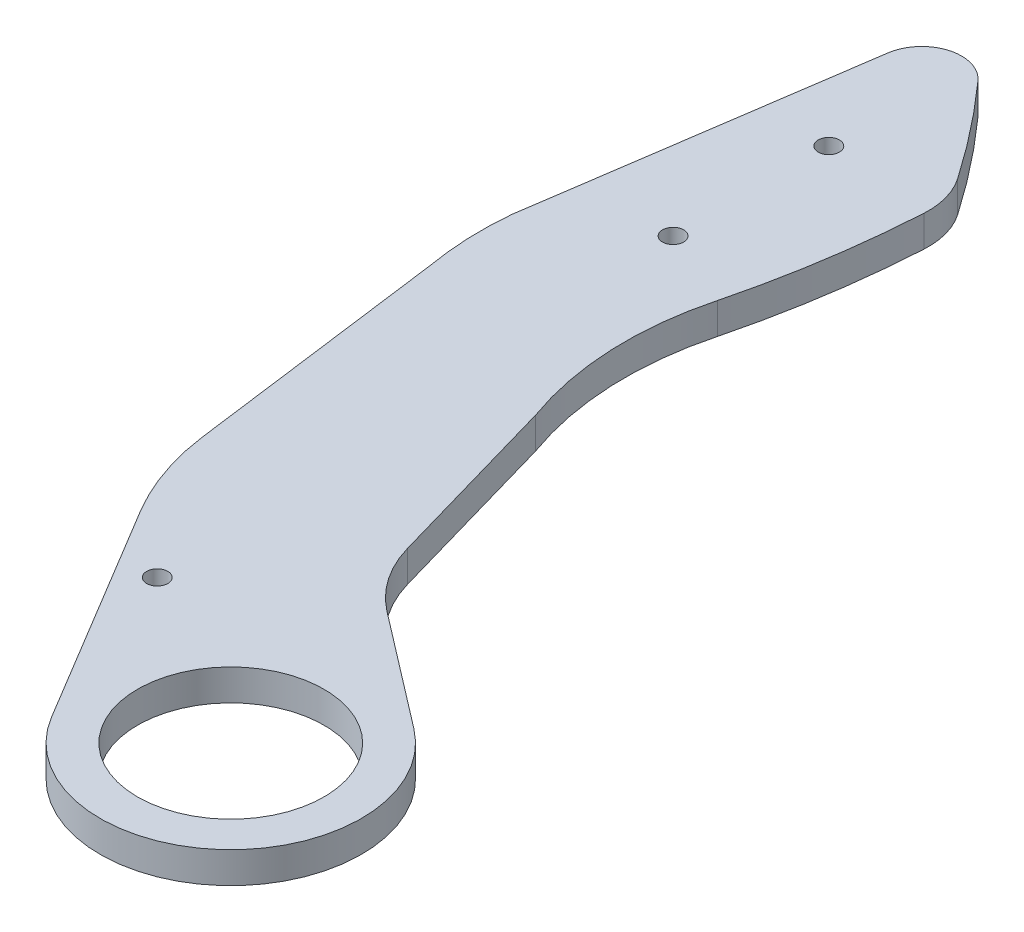
ISO-10303-21;
HEADER;
FILE_DESCRIPTION(('STEP AP214'),'2;1');
FILE_NAME('part.step','',(''),(''),'','','');
FILE_SCHEMA(('AUTOMOTIVE_DESIGN { 1 0 10303 214 1 1 1 1 }'));
ENDSEC;
DATA;
#1=APPLICATION_CONTEXT('core data for automotive mechanical design processes');
#2=APPLICATION_PROTOCOL_DEFINITION('international standard','automotive_design',2000,#1);
#3=PRODUCT_CONTEXT('',#1,'mechanical');
#4=PRODUCT('Part','Part','',(#3));
#5=PRODUCT_RELATED_PRODUCT_CATEGORY('part','',(#4));
#6=PRODUCT_DEFINITION_FORMATION('','',#4);
#7=PRODUCT_DEFINITION_CONTEXT('part definition',#1,'design');
#8=PRODUCT_DEFINITION('design','',#6,#7);
#9=PRODUCT_DEFINITION_SHAPE('','',#8);
#10=(LENGTH_UNIT() NAMED_UNIT(*) SI_UNIT(.MILLI.,.METRE.));
#11=(NAMED_UNIT(*) PLANE_ANGLE_UNIT() SI_UNIT($,.RADIAN.));
#12=(NAMED_UNIT(*) SI_UNIT($,.STERADIAN.) SOLID_ANGLE_UNIT());
#13=UNCERTAINTY_MEASURE_WITH_UNIT(LENGTH_MEASURE(1.E-05),#10,'distance_accuracy_value','');
#14=(GEOMETRIC_REPRESENTATION_CONTEXT(3) GLOBAL_UNCERTAINTY_ASSIGNED_CONTEXT((#13)) GLOBAL_UNIT_ASSIGNED_CONTEXT((#10,
#11,#12)) REPRESENTATION_CONTEXT('',''));
#15=CARTESIAN_POINT('',(0.,0.,0.));
#16=DIRECTION('',(0.,0.,1.));
#17=DIRECTION('',(1.,0.,0.));
#18=AXIS2_PLACEMENT_3D('',#15,#16,#17);
#19=CARTESIAN_POINT('',(0.,5.,0.));
#20=DIRECTION('',(0.,-1.,0.));
#21=DIRECTION('',(0.,0.,-1.));
#22=AXIS2_PLACEMENT_3D('',#19,#20,#21);
#23=PLANE('',#22);
#24=CARTESIAN_POINT('',(-35.,5.,-131.));
#25=DIRECTION('',(0.,1.,0.));
#26=DIRECTION('',(0.,0.,1.));
#27=AXIS2_PLACEMENT_3D('',#24,#25,#26);
#28=CIRCLE('',#27,1.7);
#29=CARTESIAN_POINT('',(-35.,5.,-129.3));
#30=VERTEX_POINT('',#29);
#31=EDGE_CURVE('E357',#30,#30,#28,.T.);
#32=ORIENTED_EDGE('',*,*,#31,.F.);
#33=EDGE_LOOP('',(#32));
#34=FACE_BOUND('',#33,.T.);
#35=CARTESIAN_POINT('',(-35.,5.,-106.));
#36=DIRECTION('',(0.,1.,0.));
#37=DIRECTION('',(0.,0.,1.));
#38=AXIS2_PLACEMENT_3D('',#35,#36,#37);
#39=CIRCLE('',#38,1.7);
#40=CARTESIAN_POINT('',(-35.,5.,-104.3));
#41=VERTEX_POINT('',#40);
#42=EDGE_CURVE('E366',#41,#41,#39,.T.);
#43=ORIENTED_EDGE('',*,*,#42,.F.);
#44=EDGE_LOOP('',(#43));
#45=FACE_BOUND('',#44,.T.);
#46=CARTESIAN_POINT('',(0.,5.,0.));
#47=DIRECTION('',(0.,1.,0.));
#48=DIRECTION('',(0.,0.,-1.));
#49=AXIS2_PLACEMENT_3D('',#46,#47,#48);
#50=CIRCLE('',#49,20.975);
#51=CARTESIAN_POINT('',(-17.9774630782299,5.,10.8056210497537));
#52=VERTEX_POINT('',#51);
#53=CARTESIAN_POINT('',(12.7564859565184,5.,-16.6500057369705));
#54=VERTEX_POINT('',#53);
#55=EDGE_CURVE('E219',#52,#54,#50,.T.);
#56=ORIENTED_EDGE('',*,*,#55,.T.);
#57=DIRECTION('',(-0.793802418925886,0.,-0.608175730942474));
#58=VECTOR('',#57,1.);
#59=CARTESIAN_POINT('',(12.7564859565184,5.,-16.6500057369705));
#60=LINE('',#59,#58);
#61=CARTESIAN_POINT('',(-5.81260332637787,5.,-30.8768072411063));
#62=VERTEX_POINT('',#61);
#63=EDGE_CURVE('E119',#54,#62,#60,.T.);
#64=ORIENTED_EDGE('',*,*,#63,.T.);
#65=CARTESIAN_POINT('',(6.35091129247161,5.,-46.7528556196241));
#66=DIRECTION('',(0.,-1.,0.));
#67=DIRECTION('',(0.,0.,-1.));
#68=AXIS2_PLACEMENT_3D('',#65,#66,#67);
#69=CIRCLE('',#68,20.);
#70=CARTESIAN_POINT('',(-12.8764196508518,5.,-41.2474269536691));
#71=VERTEX_POINT('',#70);
#72=EDGE_CURVE('E264',#62,#71,#69,.T.);
#73=ORIENTED_EDGE('',*,*,#72,.T.);
#74=DIRECTION('',(-0.275271433297746,0.,-0.96136654716617));
#75=VECTOR('',#74,1.);
#76=CARTESIAN_POINT('',(-12.8764196508518,5.,-41.2474269536691));
#77=LINE('',#76,#75);
#78=CARTESIAN_POINT('',(-21.1345626497842,5.,-70.0884233686542));
#79=VERTEX_POINT('',#78);
#80=EDGE_CURVE('E284',#71,#79,#77,.T.);
#81=ORIENTED_EDGE('',*,*,#80,.T.);
#82=CARTESIAN_POINT('',(26.9937980567859,5.,-87.4580042567529));
#83=DIRECTION('',(0.,-1.,0.));
#84=DIRECTION('',(0.,0.,1.));
#85=AXIS2_PLACEMENT_3D('',#82,#83,#84);
#86=CIRCLE('',#85,51.1668002178163);
#87=CARTESIAN_POINT('',(-22.4565511628832,5.,-100.599709115054));
#88=VERTEX_POINT('',#87);
#89=EDGE_CURVE('E280',#79,#88,#86,.T.);
#90=ORIENTED_EDGE('',*,*,#89,.T.);
#91=CARTESIAN_POINT('',(-171.2572125516,5.,-138.292363187831));
#92=DIRECTION('',(0.,1.,0.));
#93=DIRECTION('',(0.,0.,1.));
#94=AXIS2_PLACEMENT_3D('',#91,#92,#93);
#95=CIRCLE('',#94,153.500400653449);
#96=CARTESIAN_POINT('',(-18.0206236675566,5.,-129.296762710251));
#97=VERTEX_POINT('',#96);
#98=EDGE_CURVE('E283',#88,#97,#95,.T.);
#99=ORIENTED_EDGE('',*,*,#98,.T.);
#100=CARTESIAN_POINT('',(-30.,5.,-130.));
#101=DIRECTION('',(0.,1.,0.));
#102=DIRECTION('',(0.,0.,1.));
#103=AXIS2_PLACEMENT_3D('',#100,#101,#102);
#104=CIRCLE('',#103,12.);
#105=CARTESIAN_POINT('',(-20.1163991974912,5.,-136.805470973904));
#106=VERTEX_POINT('',#105);
#107=EDGE_CURVE('E288',#97,#106,#104,.T.);
#108=ORIENTED_EDGE('',*,*,#107,.T.);
#109=CARTESIAN_POINT('',(-146.544456121145,5.,-49.7519275464318));
#110=DIRECTION('',(0.,1.,0.));
#111=DIRECTION('',(0.,0.,1.));
#112=AXIS2_PLACEMENT_3D('',#109,#110,#111);
#113=CIRCLE('',#112,153.500400653449);
#114=CARTESIAN_POINT('',(-32.0981244877031,5.,-152.047627243035));
#115=VERTEX_POINT('',#114);
#116=EDGE_CURVE('E295',#106,#115,#113,.T.);
#117=ORIENTED_EDGE('',*,*,#116,.T.);
#118=CARTESIAN_POINT('',(-36.8667216390966,5.,-147.785306422343));
#119=DIRECTION('',(0.,1.,0.));
#120=DIRECTION('',(0.,0.,1.));
#121=AXIS2_PLACEMENT_3D('',#118,#119,#120);
#122=CIRCLE('',#121,6.39585002722699);
#123=CARTESIAN_POINT('',(-43.1946157707158,5.,-148.715173848269));
#124=VERTEX_POINT('',#123);
#125=EDGE_CURVE('E298',#115,#124,#122,.T.);
#126=ORIENTED_EDGE('',*,*,#125,.T.);
#127=DIRECTION('',(-0.145386058454699,0.,0.989375001709163));
#128=VECTOR('',#127,1.);
#129=CARTESIAN_POINT('',(-43.1946157707158,5.,-148.715173848269));
#130=LINE('',#129,#128);
#131=CARTESIAN_POINT('',(-50.9327114839769,5.,-96.0562150670269));
#132=VERTEX_POINT('',#131);
#133=EDGE_CURVE('E301',#124,#132,#130,.T.);
#134=ORIENTED_EDGE('',*,*,#133,.T.);
#135=CARTESIAN_POINT('',(0.00716740026227708,5.,-91.2426733575386));
#136=DIRECTION('',(0.,1.,0.));
#137=DIRECTION('',(0.,0.,1.));
#138=AXIS2_PLACEMENT_3D('',#135,#136,#137);
#139=CIRCLE('',#138,51.1668002178164);
#140=CARTESIAN_POINT('',(-50.3834749970696,5.,-82.3643512573803));
#141=VERTEX_POINT('',#140);
#142=EDGE_CURVE('E156',#132,#141,#139,.T.);
#143=ORIENTED_EDGE('',*,*,#142,.T.);
#144=DIRECTION('',(0.130981717678106,0.,0.991384783842325));
#145=VECTOR('',#144,1.);
#146=CARTESIAN_POINT('',(-50.3834749970696,5.,-82.3643512573803));
#147=LINE('',#146,#145);
#148=CARTESIAN_POINT('',(-44.8247207448711,5.,-40.2908124426612));
#149=VERTEX_POINT('',#148);
#150=EDGE_CURVE('E150',#141,#149,#147,.T.);
#151=ORIENTED_EDGE('',*,*,#150,.T.);
#152=CARTESIAN_POINT('',(-5.16932939117814,5.,-45.5300811497855));
#153=DIRECTION('',(0.,1.,0.));
#154=DIRECTION('',(0.,0.,1.));
#155=AXIS2_PLACEMENT_3D('',#152,#153,#154);
#156=CIRCLE('',#155,40.);
#157=CARTESIAN_POINT('',(-39.4529300171232,5.,-24.9234140703983));
#158=VERTEX_POINT('',#157);
#159=EDGE_CURVE('E154',#149,#158,#156,.T.);
#160=ORIENTED_EDGE('',*,*,#159,.T.);
#161=DIRECTION('',(0.515166676984679,0.,0.857090015648627));
#162=VECTOR('',#161,1.);
#163=CARTESIAN_POINT('',(-39.4529300171232,5.,-24.9234140703983));
#164=LINE('',#163,#162);
#165=EDGE_CURVE('E58',#158,#52,#164,.T.);
#166=ORIENTED_EDGE('',*,*,#165,.T.);
#167=EDGE_LOOP('',(#56,#64,#73,#81,#90,#99,#108,#117,#126,#134,#143,#151,#160,#166));
#168=FACE_BOUND('',#167,.T.);
#169=CARTESIAN_POINT('',(0.,5.,0.));
#170=DIRECTION('',(0.,1.,0.));
#171=DIRECTION('',(0.,0.,1.));
#172=AXIS2_PLACEMENT_3D('',#169,#170,#171);
#173=CIRCLE('',#172,14.975);
#174=CARTESIAN_POINT('',(0.,5.,14.975));
#175=VERTEX_POINT('',#174);
#176=EDGE_CURVE('E183',#175,#175,#173,.T.);
#177=ORIENTED_EDGE('',*,*,#176,.F.);
#178=EDGE_LOOP('',(#177));
#179=FACE_BOUND('',#178,.T.);
#180=CARTESIAN_POINT('',(-28.9308488131652,5.,-17.1232769045466));
#181=DIRECTION('',(0.,1.,0.));
#182=DIRECTION('',(0.,0.,1.));
#183=AXIS2_PLACEMENT_3D('',#180,#181,#182);
#184=CIRCLE('',#183,1.7);
#185=CARTESIAN_POINT('',(-28.9308488131652,5.,-15.4232769045466));
#186=VERTEX_POINT('',#185);
#187=EDGE_CURVE('E364',#186,#186,#184,.T.);
#188=ORIENTED_EDGE('',*,*,#187,.F.);
#189=EDGE_LOOP('',(#188));
#190=FACE_BOUND('',#189,.T.);
#191=ADVANCED_FACE('F40',(#34,#45,#168,#179,#190),#23,.F.);
#192=CARTESIAN_POINT('',(0.,0.,0.));
#193=DIRECTION('',(0.,-1.,0.));
#194=DIRECTION('',(0.,0.,-1.));
#195=AXIS2_PLACEMENT_3D('',#192,#193,#194);
#196=PLANE('',#195);
#197=CARTESIAN_POINT('',(-35.,0.,-131.));
#198=DIRECTION('',(0.,-1.,0.));
#199=DIRECTION('',(0.,0.,-1.));
#200=AXIS2_PLACEMENT_3D('',#197,#198,#199);
#201=CIRCLE('',#200,1.7);
#202=CARTESIAN_POINT('',(-35.,0.,-132.7));
#203=VERTEX_POINT('',#202);
#204=EDGE_CURVE('E355',#203,#203,#201,.F.);
#205=ORIENTED_EDGE('',*,*,#204,.T.);
#206=EDGE_LOOP('',(#205));
#207=FACE_BOUND('',#206,.T.);
#208=CARTESIAN_POINT('',(-35.,0.,-106.));
#209=DIRECTION('',(0.,-1.,0.));
#210=DIRECTION('',(0.,0.,-1.));
#211=AXIS2_PLACEMENT_3D('',#208,#209,#210);
#212=CIRCLE('',#211,1.7);
#213=CARTESIAN_POINT('',(-35.,0.,-107.7));
#214=VERTEX_POINT('',#213);
#215=EDGE_CURVE('E372',#214,#214,#212,.F.);
#216=ORIENTED_EDGE('',*,*,#215,.T.);
#217=EDGE_LOOP('',(#216));
#218=FACE_BOUND('',#217,.T.);
#219=CARTESIAN_POINT('',(0.,0.,0.));
#220=DIRECTION('',(0.,1.,0.));
#221=DIRECTION('',(0.,0.,1.));
#222=AXIS2_PLACEMENT_3D('',#219,#220,#221);
#223=CIRCLE('',#222,14.975);
#224=CARTESIAN_POINT('',(0.,0.,14.975));
#225=VERTEX_POINT('',#224);
#226=EDGE_CURVE('E378',#225,#225,#223,.T.);
#227=ORIENTED_EDGE('',*,*,#226,.T.);
#228=EDGE_LOOP('',(#227));
#229=FACE_BOUND('',#228,.T.);
#230=CARTESIAN_POINT('',(0.,0.,0.));
#231=DIRECTION('',(0.,1.,0.));
#232=DIRECTION('',(0.,0.,-1.));
#233=AXIS2_PLACEMENT_3D('',#230,#231,#232);
#234=CIRCLE('',#233,20.975);
#235=CARTESIAN_POINT('',(-17.9774630782299,0.,10.8056210497537));
#236=VERTEX_POINT('',#235);
#237=CARTESIAN_POINT('',(12.7564859565184,0.,-16.6500057369705));
#238=VERTEX_POINT('',#237);
#239=EDGE_CURVE('E178',#236,#238,#234,.T.);
#240=ORIENTED_EDGE('',*,*,#239,.F.);
#241=DIRECTION('',(0.515166676984679,0.,0.857090015648627));
#242=VECTOR('',#241,1.);
#243=CARTESIAN_POINT('',(-39.4529300171232,0.,-24.9234140703983));
#244=LINE('',#243,#242);
#245=CARTESIAN_POINT('',(-39.4529300171232,0.,-24.9234140703983));
#246=VERTEX_POINT('',#245);
#247=EDGE_CURVE('E111',#246,#236,#244,.T.);
#248=ORIENTED_EDGE('',*,*,#247,.F.);
#249=CARTESIAN_POINT('',(-5.16932939117814,0.,-45.5300811497855));
#250=DIRECTION('',(0.,1.,0.));
#251=DIRECTION('',(0.,0.,1.));
#252=AXIS2_PLACEMENT_3D('',#249,#250,#251);
#253=CIRCLE('',#252,40.);
#254=CARTESIAN_POINT('',(-44.8247207448711,0.,-40.2908124426612));
#255=VERTEX_POINT('',#254);
#256=EDGE_CURVE('E105',#255,#246,#253,.T.);
#257=ORIENTED_EDGE('',*,*,#256,.F.);
#258=DIRECTION('',(0.130981717678106,0.,0.991384783842325));
#259=VECTOR('',#258,1.);
#260=CARTESIAN_POINT('',(-50.3834749970696,0.,-82.3643512573803));
#261=LINE('',#260,#259);
#262=CARTESIAN_POINT('',(-50.3834749970696,0.,-82.3643512573803));
#263=VERTEX_POINT('',#262);
#264=EDGE_CURVE('E165',#263,#255,#261,.T.);
#265=ORIENTED_EDGE('',*,*,#264,.F.);
#266=CARTESIAN_POINT('',(0.00716740026227708,0.,-91.2426733575386));
#267=DIRECTION('',(0.,1.,0.));
#268=DIRECTION('',(0.,0.,1.));
#269=AXIS2_PLACEMENT_3D('',#266,#267,#268);
#270=CIRCLE('',#269,51.1668002178164);
#271=CARTESIAN_POINT('',(-50.9327114839769,0.,-96.0562150670269));
#272=VERTEX_POINT('',#271);
#273=EDGE_CURVE('E210',#272,#263,#270,.T.);
#274=ORIENTED_EDGE('',*,*,#273,.F.);
#275=DIRECTION('',(-0.145386058454699,0.,0.989375001709163));
#276=VECTOR('',#275,1.);
#277=CARTESIAN_POINT('',(-43.1946157707158,0.,-148.715173848269));
#278=LINE('',#277,#276);
#279=CARTESIAN_POINT('',(-43.1946157707158,0.,-148.715173848269));
#280=VERTEX_POINT('',#279);
#281=EDGE_CURVE('E207',#280,#272,#278,.T.);
#282=ORIENTED_EDGE('',*,*,#281,.F.);
#283=CARTESIAN_POINT('',(-36.8667216390966,0.,-147.785306422343));
#284=DIRECTION('',(0.,1.,0.));
#285=DIRECTION('',(0.,0.,1.));
#286=AXIS2_PLACEMENT_3D('',#283,#284,#285);
#287=CIRCLE('',#286,6.39585002722699);
#288=CARTESIAN_POINT('',(-32.0981244877031,0.,-152.047627243035));
#289=VERTEX_POINT('',#288);
#290=EDGE_CURVE('E204',#289,#280,#287,.T.);
#291=ORIENTED_EDGE('',*,*,#290,.F.);
#292=CARTESIAN_POINT('',(-146.544456121145,0.,-49.7519275464318));
#293=DIRECTION('',(0.,1.,0.));
#294=DIRECTION('',(0.,0.,1.));
#295=AXIS2_PLACEMENT_3D('',#292,#293,#294);
#296=CIRCLE('',#295,153.500400653449);
#297=CARTESIAN_POINT('',(-20.1163991974912,0.,-136.805470973904));
#298=VERTEX_POINT('',#297);
#299=EDGE_CURVE('E201',#298,#289,#296,.T.);
#300=ORIENTED_EDGE('',*,*,#299,.F.);
#301=CARTESIAN_POINT('',(-30.,0.,-130.));
#302=DIRECTION('',(0.,1.,0.));
#303=DIRECTION('',(0.,0.,1.));
#304=AXIS2_PLACEMENT_3D('',#301,#302,#303);
#305=CIRCLE('',#304,12.);
#306=CARTESIAN_POINT('',(-18.0206236675566,0.,-129.296762710251));
#307=VERTEX_POINT('',#306);
#308=EDGE_CURVE('E198',#307,#298,#305,.T.);
#309=ORIENTED_EDGE('',*,*,#308,.F.);
#310=CARTESIAN_POINT('',(-171.2572125516,0.,-138.292363187831));
#311=DIRECTION('',(0.,1.,0.));
#312=DIRECTION('',(0.,0.,1.));
#313=AXIS2_PLACEMENT_3D('',#310,#311,#312);
#314=CIRCLE('',#313,153.500400653449);
#315=CARTESIAN_POINT('',(-22.4565511628832,0.,-100.599709115054));
#316=VERTEX_POINT('',#315);
#317=EDGE_CURVE('E195',#316,#307,#314,.T.);
#318=ORIENTED_EDGE('',*,*,#317,.F.);
#319=CARTESIAN_POINT('',(26.9937980567859,0.,-87.4580042567529));
#320=DIRECTION('',(0.,-1.,0.));
#321=DIRECTION('',(0.,0.,1.));
#322=AXIS2_PLACEMENT_3D('',#319,#320,#321);
#323=CIRCLE('',#322,51.1668002178163);
#324=CARTESIAN_POINT('',(-21.1345626497842,0.,-70.0884233686542));
#325=VERTEX_POINT('',#324);
#326=EDGE_CURVE('E192',#325,#316,#323,.T.);
#327=ORIENTED_EDGE('',*,*,#326,.F.);
#328=DIRECTION('',(-0.275271433297746,0.,-0.96136654716617));
#329=VECTOR('',#328,1.);
#330=CARTESIAN_POINT('',(-12.8764196508518,0.,-41.2474269536691));
#331=LINE('',#330,#329);
#332=CARTESIAN_POINT('',(-12.8764196508518,0.,-41.2474269536691));
#333=VERTEX_POINT('',#332);
#334=EDGE_CURVE('E189',#333,#325,#331,.T.);
#335=ORIENTED_EDGE('',*,*,#334,.F.);
#336=CARTESIAN_POINT('',(6.35091129247161,0.,-46.7528556196241));
#337=DIRECTION('',(0.,-1.,0.));
#338=DIRECTION('',(0.,0.,-1.));
#339=AXIS2_PLACEMENT_3D('',#336,#337,#338);
#340=CIRCLE('',#339,20.);
#341=CARTESIAN_POINT('',(-5.81260332637787,0.,-30.8768072411063));
#342=VERTEX_POINT('',#341);
#343=EDGE_CURVE('E186',#342,#333,#340,.T.);
#344=ORIENTED_EDGE('',*,*,#343,.F.);
#345=DIRECTION('',(-0.793802418925886,0.,-0.608175730942474));
#346=VECTOR('',#345,1.);
#347=CARTESIAN_POINT('',(12.7564859565184,0.,-16.6500057369705));
#348=LINE('',#347,#346);
#349=EDGE_CURVE('E182',#238,#342,#348,.T.);
#350=ORIENTED_EDGE('',*,*,#349,.F.);
#351=EDGE_LOOP('',(#240,#248,#257,#265,#274,#282,#291,#300,#309,#318,#327,#335,#344,#350));
#352=FACE_BOUND('',#351,.T.);
#353=CARTESIAN_POINT('',(-28.9308488131652,0.,-17.1232769045466));
#354=DIRECTION('',(0.,1.,0.));
#355=DIRECTION('',(0.,0.,1.));
#356=AXIS2_PLACEMENT_3D('',#353,#354,#355);
#357=CIRCLE('',#356,1.7);
#358=CARTESIAN_POINT('',(-28.9308488131652,0.,-15.4232769045466));
#359=VERTEX_POINT('',#358);
#360=EDGE_CURVE('E359',#359,#359,#357,.T.);
#361=ORIENTED_EDGE('',*,*,#360,.T.);
#362=EDGE_LOOP('',(#361));
#363=FACE_BOUND('',#362,.T.);
#364=ADVANCED_FACE('F268',(#207,#218,#229,#352,#363),#196,.T.);
#365=CARTESIAN_POINT('',(0.,5.,0.));
#366=DIRECTION('',(0.,-1.,0.));
#367=DIRECTION('',(0.,0.,-1.));
#368=AXIS2_PLACEMENT_3D('',#365,#366,#367);
#369=CYLINDRICAL_SURFACE('',#368,20.975);
#370=ORIENTED_EDGE('',*,*,#239,.T.);
#371=DIRECTION('',(0.,-1.,0.));
#372=VECTOR('',#371,1.);
#373=CARTESIAN_POINT('',(12.7564859565184,5.,-16.6500057369705));
#374=LINE('',#373,#372);
#375=EDGE_CURVE('E11',#54,#238,#374,.T.);
#376=ORIENTED_EDGE('',*,*,#375,.F.);
#377=ORIENTED_EDGE('',*,*,#55,.F.);
#378=DIRECTION('',(0.,-1.,0.));
#379=VECTOR('',#378,1.);
#380=CARTESIAN_POINT('',(-17.9774630782299,5.,10.8056210497537));
#381=LINE('',#380,#379);
#382=EDGE_CURVE('E174',#52,#236,#381,.T.);
#383=ORIENTED_EDGE('',*,*,#382,.T.);
#384=EDGE_LOOP('',(#370,#376,#377,#383));
#385=FACE_BOUND('',#384,.T.);
#386=ADVANCED_FACE('F42',(#385),#369,.T.);
#387=CARTESIAN_POINT('',(12.7564859565184,5.,-16.6500057369705));
#388=DIRECTION('',(-0.608175730942474,0.,0.793802418925886));
#389=DIRECTION('',(0.793802418925886,0.,0.608175730942474));
#390=AXIS2_PLACEMENT_3D('',#387,#388,#389);
#391=PLANE('',#390);
#392=ORIENTED_EDGE('',*,*,#349,.T.);
#393=DIRECTION('',(0.,-1.,0.));
#394=VECTOR('',#393,1.);
#395=CARTESIAN_POINT('',(-5.81260332637787,5.,-30.8768072411063));
#396=LINE('',#395,#394);
#397=EDGE_CURVE('E50',#62,#342,#396,.T.);
#398=ORIENTED_EDGE('',*,*,#397,.F.);
#399=ORIENTED_EDGE('',*,*,#63,.F.);
#400=ORIENTED_EDGE('',*,*,#375,.T.);
#401=EDGE_LOOP('',(#392,#398,#399,#400));
#402=FACE_BOUND('',#401,.T.);
#403=ADVANCED_FACE('F515',(#402),#391,.F.);
#404=CARTESIAN_POINT('',(6.35091129247161,5.,-46.7528556196241));
#405=DIRECTION('',(0.,-1.,0.));
#406=DIRECTION('',(0.,0.,-1.));
#407=AXIS2_PLACEMENT_3D('',#404,#405,#406);
#408=CYLINDRICAL_SURFACE('',#407,20.);
#409=ORIENTED_EDGE('',*,*,#343,.T.);
#410=DIRECTION('',(0.,-1.,0.));
#411=VECTOR('',#410,1.);
#412=CARTESIAN_POINT('',(-12.8764196508518,5.,-41.2474269536691));
#413=LINE('',#412,#411);
#414=EDGE_CURVE('E254',#71,#333,#413,.T.);
#415=ORIENTED_EDGE('',*,*,#414,.F.);
#416=ORIENTED_EDGE('',*,*,#72,.F.);
#417=ORIENTED_EDGE('',*,*,#397,.T.);
#418=EDGE_LOOP('',(#409,#415,#416,#417));
#419=FACE_BOUND('',#418,.T.);
#420=ADVANCED_FACE('F262',(#419),#408,.F.);
#421=CARTESIAN_POINT('',(-12.8764196508518,5.,-41.2474269536691));
#422=DIRECTION('',(-0.961366547166171,0.,0.275271433297746));
#423=DIRECTION('',(0.275271433297746,0.,0.96136654716617));
#424=AXIS2_PLACEMENT_3D('',#421,#422,#423);
#425=PLANE('',#424);
#426=ORIENTED_EDGE('',*,*,#334,.T.);
#427=DIRECTION('',(0.,-1.,0.));
#428=VECTOR('',#427,1.);
#429=CARTESIAN_POINT('',(-21.1345626497842,5.,-70.0884233686542));
#430=LINE('',#429,#428);
#431=EDGE_CURVE('E250',#79,#325,#430,.T.);
#432=ORIENTED_EDGE('',*,*,#431,.F.);
#433=ORIENTED_EDGE('',*,*,#80,.F.);
#434=ORIENTED_EDGE('',*,*,#414,.T.);
#435=EDGE_LOOP('',(#426,#432,#433,#434));
#436=FACE_BOUND('',#435,.T.);
#437=ADVANCED_FACE('F274',(#436),#425,.F.);
#438=CARTESIAN_POINT('',(26.9937980567859,5.,-87.4580042567529));
#439=DIRECTION('',(0.,-1.,0.));
#440=DIRECTION('',(0.,0.,-1.));
#441=AXIS2_PLACEMENT_3D('',#438,#439,#440);
#442=CYLINDRICAL_SURFACE('',#441,51.1668002178163);
#443=ORIENTED_EDGE('',*,*,#326,.T.);
#444=DIRECTION('',(0.,-1.,0.));
#445=VECTOR('',#444,1.);
#446=CARTESIAN_POINT('',(-22.4565511628832,5.,-100.599709115054));
#447=LINE('',#446,#445);
#448=EDGE_CURVE('E246',#88,#316,#447,.T.);
#449=ORIENTED_EDGE('',*,*,#448,.F.);
#450=ORIENTED_EDGE('',*,*,#89,.F.);
#451=ORIENTED_EDGE('',*,*,#431,.T.);
#452=EDGE_LOOP('',(#443,#449,#450,#451));
#453=FACE_BOUND('',#452,.T.);
#454=ADVANCED_FACE('F278',(#453),#442,.F.);
#455=CARTESIAN_POINT('',(-171.2572125516,5.,-138.292363187831));
#456=DIRECTION('',(0.,-1.,0.));
#457=DIRECTION('',(0.,0.,-1.));
#458=AXIS2_PLACEMENT_3D('',#455,#456,#457);
#459=CYLINDRICAL_SURFACE('',#458,153.500400653449);
#460=ORIENTED_EDGE('',*,*,#317,.T.);
#461=DIRECTION('',(0.,-1.,0.));
#462=VECTOR('',#461,1.);
#463=CARTESIAN_POINT('',(-18.0206236675566,5.,-129.296762710251));
#464=LINE('',#463,#462);
#465=EDGE_CURVE('E242',#97,#307,#464,.T.);
#466=ORIENTED_EDGE('',*,*,#465,.F.);
#467=ORIENTED_EDGE('',*,*,#98,.F.);
#468=ORIENTED_EDGE('',*,*,#448,.T.);
#469=EDGE_LOOP('',(#460,#466,#467,#468));
#470=FACE_BOUND('',#469,.T.);
#471=ADVANCED_FACE('F480',(#470),#459,.T.);
#472=CARTESIAN_POINT('',(-30.,5.,-130.));
#473=DIRECTION('',(0.,-1.,0.));
#474=DIRECTION('',(0.,0.,-1.));
#475=AXIS2_PLACEMENT_3D('',#472,#473,#474);
#476=CYLINDRICAL_SURFACE('',#475,12.);
#477=ORIENTED_EDGE('',*,*,#308,.T.);
#478=DIRECTION('',(0.,-1.,0.));
#479=VECTOR('',#478,1.);
#480=CARTESIAN_POINT('',(-20.1163991974912,5.,-136.805470973904));
#481=LINE('',#480,#479);
#482=EDGE_CURVE('E238',#106,#298,#481,.T.);
#483=ORIENTED_EDGE('',*,*,#482,.F.);
#484=ORIENTED_EDGE('',*,*,#107,.F.);
#485=ORIENTED_EDGE('',*,*,#465,.T.);
#486=EDGE_LOOP('',(#477,#483,#484,#485));
#487=FACE_BOUND('',#486,.T.);
#488=ADVANCED_FACE('F470',(#487),#476,.T.);
#489=CARTESIAN_POINT('',(-146.544456121145,5.,-49.7519275464318));
#490=DIRECTION('',(0.,-1.,0.));
#491=DIRECTION('',(0.,0.,-1.));
#492=AXIS2_PLACEMENT_3D('',#489,#490,#491);
#493=CYLINDRICAL_SURFACE('',#492,153.500400653449);
#494=ORIENTED_EDGE('',*,*,#299,.T.);
#495=DIRECTION('',(0.,-1.,0.));
#496=VECTOR('',#495,1.);
#497=CARTESIAN_POINT('',(-32.0981244877031,5.,-152.047627243035));
#498=LINE('',#497,#496);
#499=EDGE_CURVE('E234',#115,#289,#498,.T.);
#500=ORIENTED_EDGE('',*,*,#499,.F.);
#501=ORIENTED_EDGE('',*,*,#116,.F.);
#502=ORIENTED_EDGE('',*,*,#482,.T.);
#503=EDGE_LOOP('',(#494,#500,#501,#502));
#504=FACE_BOUND('',#503,.T.);
#505=ADVANCED_FACE('F460',(#504),#493,.T.);
#506=CARTESIAN_POINT('',(-36.8667216390966,5.,-147.785306422343));
#507=DIRECTION('',(0.,-1.,0.));
#508=DIRECTION('',(0.,0.,-1.));
#509=AXIS2_PLACEMENT_3D('',#506,#507,#508);
#510=CYLINDRICAL_SURFACE('',#509,6.39585002722699);
#511=ORIENTED_EDGE('',*,*,#290,.T.);
#512=DIRECTION('',(0.,-1.,0.));
#513=VECTOR('',#512,1.);
#514=CARTESIAN_POINT('',(-43.1946157707158,5.,-148.715173848269));
#515=LINE('',#514,#513);
#516=EDGE_CURVE('E230',#124,#280,#515,.T.);
#517=ORIENTED_EDGE('',*,*,#516,.F.);
#518=ORIENTED_EDGE('',*,*,#125,.F.);
#519=ORIENTED_EDGE('',*,*,#499,.T.);
#520=EDGE_LOOP('',(#511,#517,#518,#519));
#521=FACE_BOUND('',#520,.T.);
#522=ADVANCED_FACE('F451',(#521),#510,.T.);
#523=CARTESIAN_POINT('',(-43.1946157707158,5.,-148.715173848269));
#524=DIRECTION('',(0.989375001709163,0.,0.145386058454699));
#525=DIRECTION('',(0.145386058454699,0.,-0.989375001709163));
#526=AXIS2_PLACEMENT_3D('',#523,#524,#525);
#527=PLANE('',#526);
#528=ORIENTED_EDGE('',*,*,#281,.T.);
#529=DIRECTION('',(0.,-1.,0.));
#530=VECTOR('',#529,1.);
#531=CARTESIAN_POINT('',(-50.9327114839769,5.,-96.0562150670269));
#532=LINE('',#531,#530);
#533=EDGE_CURVE('E226',#132,#272,#532,.T.);
#534=ORIENTED_EDGE('',*,*,#533,.F.);
#535=ORIENTED_EDGE('',*,*,#133,.F.);
#536=ORIENTED_EDGE('',*,*,#516,.T.);
#537=EDGE_LOOP('',(#528,#534,#535,#536));
#538=FACE_BOUND('',#537,.T.);
#539=ADVANCED_FACE('F309',(#538),#527,.F.);
#540=CARTESIAN_POINT('',(0.00716740026227708,5.,-91.2426733575386));
#541=DIRECTION('',(0.,-1.,0.));
#542=DIRECTION('',(0.,0.,-1.));
#543=AXIS2_PLACEMENT_3D('',#540,#541,#542);
#544=CYLINDRICAL_SURFACE('',#543,51.1668002178164);
#545=ORIENTED_EDGE('',*,*,#273,.T.);
#546=DIRECTION('',(0.,-1.,0.));
#547=VECTOR('',#546,1.);
#548=CARTESIAN_POINT('',(-50.3834749970696,5.,-82.3643512573803));
#549=LINE('',#548,#547);
#550=EDGE_CURVE('E167',#141,#263,#549,.T.);
#551=ORIENTED_EDGE('',*,*,#550,.F.);
#552=ORIENTED_EDGE('',*,*,#142,.F.);
#553=ORIENTED_EDGE('',*,*,#533,.T.);
#554=EDGE_LOOP('',(#545,#551,#552,#553));
#555=FACE_BOUND('',#554,.T.);
#556=ADVANCED_FACE('F313',(#555),#544,.T.);
#557=CARTESIAN_POINT('',(-50.3834749970696,5.,-82.3643512573803));
#558=DIRECTION('',(0.991384783842325,0.,-0.130981717678106));
#559=DIRECTION('',(-0.130981717678106,0.,-0.991384783842325));
#560=AXIS2_PLACEMENT_3D('',#557,#558,#559);
#561=PLANE('',#560);
#562=ORIENTED_EDGE('',*,*,#264,.T.);
#563=DIRECTION('',(0.,-1.,0.));
#564=VECTOR('',#563,1.);
#565=CARTESIAN_POINT('',(-44.8247207448711,5.,-40.2908124426612));
#566=LINE('',#565,#564);
#567=EDGE_CURVE('E162',#149,#255,#566,.T.);
#568=ORIENTED_EDGE('',*,*,#567,.F.);
#569=ORIENTED_EDGE('',*,*,#150,.F.);
#570=ORIENTED_EDGE('',*,*,#550,.T.);
#571=EDGE_LOOP('',(#562,#568,#569,#570));
#572=FACE_BOUND('',#571,.T.);
#573=ADVANCED_FACE('F163',(#572),#561,.F.);
#574=CARTESIAN_POINT('',(-5.16932939117814,5.,-45.5300811497855));
#575=DIRECTION('',(0.,-1.,0.));
#576=DIRECTION('',(0.,0.,-1.));
#577=AXIS2_PLACEMENT_3D('',#574,#575,#576);
#578=CYLINDRICAL_SURFACE('',#577,40.);
#579=ORIENTED_EDGE('',*,*,#256,.T.);
#580=DIRECTION('',(0.,-1.,0.));
#581=VECTOR('',#580,1.);
#582=CARTESIAN_POINT('',(-39.4529300171232,5.,-24.9234140703983));
#583=LINE('',#582,#581);
#584=EDGE_CURVE('E168',#158,#246,#583,.T.);
#585=ORIENTED_EDGE('',*,*,#584,.F.);
#586=ORIENTED_EDGE('',*,*,#159,.F.);
#587=ORIENTED_EDGE('',*,*,#567,.T.);
#588=EDGE_LOOP('',(#579,#585,#586,#587));
#589=FACE_BOUND('',#588,.T.);
#590=ADVANCED_FACE('F170',(#589),#578,.T.);
#591=CARTESIAN_POINT('',(-39.4529300171232,5.,-24.9234140703983));
#592=DIRECTION('',(0.857090015648627,0.,-0.515166676984679));
#593=DIRECTION('',(-0.515166676984679,0.,-0.857090015648627));
#594=AXIS2_PLACEMENT_3D('',#591,#592,#593);
#595=PLANE('',#594);
#596=ORIENTED_EDGE('',*,*,#247,.T.);
#597=ORIENTED_EDGE('',*,*,#382,.F.);
#598=ORIENTED_EDGE('',*,*,#165,.F.);
#599=ORIENTED_EDGE('',*,*,#584,.T.);
#600=EDGE_LOOP('',(#596,#597,#598,#599));
#601=FACE_BOUND('',#600,.T.);
#602=ADVANCED_FACE('F317',(#601),#595,.F.);
#603=CARTESIAN_POINT('',(0.,5.,0.));
#604=DIRECTION('',(0.,-1.,0.));
#605=DIRECTION('',(0.,0.,-1.));
#606=AXIS2_PLACEMENT_3D('',#603,#604,#605);
#607=CYLINDRICAL_SURFACE('',#606,14.975);
#608=ORIENTED_EDGE('',*,*,#176,.T.);
#609=EDGE_LOOP('',(#608));
#610=FACE_BOUND('',#609,.T.);
#611=ORIENTED_EDGE('',*,*,#226,.F.);
#612=EDGE_LOOP('',(#611));
#613=FACE_BOUND('',#612,.T.);
#614=ADVANCED_FACE('F319',(#610,#613),#607,.F.);
#615=CARTESIAN_POINT('',(-28.9308488131652,5.,-17.1232769045466));
#616=DIRECTION('',(0.,-1.,0.));
#617=DIRECTION('',(0.,0.,-1.));
#618=AXIS2_PLACEMENT_3D('',#615,#616,#617);
#619=CYLINDRICAL_SURFACE('',#618,1.7);
#620=ORIENTED_EDGE('',*,*,#187,.T.);
#621=EDGE_LOOP('',(#620));
#622=FACE_BOUND('',#621,.T.);
#623=ORIENTED_EDGE('',*,*,#360,.F.);
#624=EDGE_LOOP('',(#623));
#625=FACE_BOUND('',#624,.T.);
#626=ADVANCED_FACE('F325',(#622,#625),#619,.F.);
#627=CARTESIAN_POINT('',(-35.,-0.00100000000000013,-106.));
#628=DIRECTION('',(0.,1.,0.));
#629=DIRECTION('',(0.,0.,1.));
#630=AXIS2_PLACEMENT_3D('',#627,#628,#629);
#631=CYLINDRICAL_SURFACE('',#630,1.7);
#632=ORIENTED_EDGE('',*,*,#215,.F.);
#633=EDGE_LOOP('',(#632));
#634=FACE_BOUND('',#633,.T.);
#635=ORIENTED_EDGE('',*,*,#42,.T.);
#636=EDGE_LOOP('',(#635));
#637=FACE_BOUND('',#636,.T.);
#638=ADVANCED_FACE('F342',(#634,#637),#631,.F.);
#639=CARTESIAN_POINT('',(-35.,-0.00100000000000013,-131.));
#640=DIRECTION('',(0.,1.,0.));
#641=DIRECTION('',(0.,0.,1.));
#642=AXIS2_PLACEMENT_3D('',#639,#640,#641);
#643=CYLINDRICAL_SURFACE('',#642,1.7);
#644=ORIENTED_EDGE('',*,*,#204,.F.);
#645=EDGE_LOOP('',(#644));
#646=FACE_BOUND('',#645,.T.);
#647=ORIENTED_EDGE('',*,*,#31,.T.);
#648=EDGE_LOOP('',(#647));
#649=FACE_BOUND('',#648,.T.);
#650=ADVANCED_FACE('F346',(#646,#649),#643,.F.);
#651=CLOSED_SHELL('',(#191,#364,#386,#403,#420,#437,#454,#471,#488,#505,#522,#539,#556,#573,
#590,#602,#614,#626,#638,#650));
#652=MANIFOLD_SOLID_BREP('B2',#651);
#653=ADVANCED_BREP_SHAPE_REPRESENTATION('',(#18,#652),#14);
#654=SHAPE_DEFINITION_REPRESENTATION(#9,#653);
ENDSEC;
END-ISO-10303-21;
